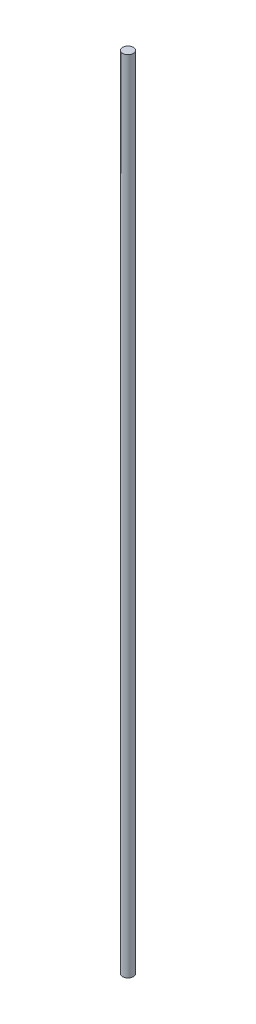
ISO-10303-21;
HEADER;
FILE_DESCRIPTION(('STEP AP214'),'2;1');
FILE_NAME('part.step','',(''),(''),'','','');
FILE_SCHEMA(('AUTOMOTIVE_DESIGN { 1 0 10303 214 1 1 1 1 }'));
ENDSEC;
DATA;
#1=APPLICATION_CONTEXT('core data for automotive mechanical design processes');
#2=APPLICATION_PROTOCOL_DEFINITION('international standard','automotive_design',2000,#1);
#3=PRODUCT_CONTEXT('',#1,'mechanical');
#4=PRODUCT('Part','Part','',(#3));
#5=PRODUCT_RELATED_PRODUCT_CATEGORY('part','',(#4));
#6=PRODUCT_DEFINITION_FORMATION('','',#4);
#7=PRODUCT_DEFINITION_CONTEXT('part definition',#1,'design');
#8=PRODUCT_DEFINITION('design','',#6,#7);
#9=PRODUCT_DEFINITION_SHAPE('','',#8);
#10=(LENGTH_UNIT() NAMED_UNIT(*) SI_UNIT(.MILLI.,.METRE.));
#11=(NAMED_UNIT(*) PLANE_ANGLE_UNIT() SI_UNIT($,.RADIAN.));
#12=(NAMED_UNIT(*) SI_UNIT($,.STERADIAN.) SOLID_ANGLE_UNIT());
#13=UNCERTAINTY_MEASURE_WITH_UNIT(LENGTH_MEASURE(1.E-05),#10,'distance_accuracy_value','');
#14=(GEOMETRIC_REPRESENTATION_CONTEXT(3) GLOBAL_UNCERTAINTY_ASSIGNED_CONTEXT((#13)) GLOBAL_UNIT_ASSIGNED_CONTEXT((#10,
#11,#12)) REPRESENTATION_CONTEXT('',''));
#15=CARTESIAN_POINT('',(0.,0.,0.));
#16=DIRECTION('',(0.,0.,1.));
#17=DIRECTION('',(1.,0.,0.));
#18=AXIS2_PLACEMENT_3D('',#15,#16,#17);
#19=CARTESIAN_POINT('',(0.,300.,0.));
#20=DIRECTION('',(0.,-1.,0.));
#21=DIRECTION('',(0.,0.,-1.));
#22=AXIS2_PLACEMENT_3D('',#19,#20,#21);
#23=CYLINDRICAL_SURFACE('',#22,4.);
#24=CARTESIAN_POINT('',(0.,300.,0.));
#25=DIRECTION('',(0.,1.,0.));
#26=DIRECTION('',(0.,0.,1.));
#27=AXIS2_PLACEMENT_3D('',#24,#25,#26);
#28=CIRCLE('',#27,4.);
#29=CARTESIAN_POINT('',(0.,300.,4.));
#30=VERTEX_POINT('',#29);
#31=EDGE_CURVE('E10',#30,#30,#28,.T.);
#32=ORIENTED_EDGE('',*,*,#31,.F.);
#33=EDGE_LOOP('',(#32));
#34=FACE_BOUND('',#33,.T.);
#35=CARTESIAN_POINT('',(0.,-300.,0.));
#36=DIRECTION('',(0.,1.,0.));
#37=DIRECTION('',(0.,0.,1.));
#38=AXIS2_PLACEMENT_3D('',#35,#36,#37);
#39=CIRCLE('',#38,4.);
#40=CARTESIAN_POINT('',(0.,-300.,4.));
#41=VERTEX_POINT('',#40);
#42=EDGE_CURVE('E38',#41,#41,#39,.T.);
#43=ORIENTED_EDGE('',*,*,#42,.T.);
#44=EDGE_LOOP('',(#43));
#45=FACE_BOUND('',#44,.T.);
#46=ADVANCED_FACE('F35',(#34,#45),#23,.T.);
#47=CARTESIAN_POINT('',(0.,300.,0.));
#48=DIRECTION('',(0.,1.,0.));
#49=DIRECTION('',(0.,0.,1.));
#50=AXIS2_PLACEMENT_3D('',#47,#48,#49);
#51=PLANE('',#50);
#52=ORIENTED_EDGE('',*,*,#31,.T.);
#53=EDGE_LOOP('',(#52));
#54=FACE_BOUND('',#53,.T.);
#55=ADVANCED_FACE('F50',(#54),#51,.T.);
#56=CARTESIAN_POINT('',(0.,-300.,0.));
#57=DIRECTION('',(0.,1.,0.));
#58=DIRECTION('',(0.,0.,1.));
#59=AXIS2_PLACEMENT_3D('',#56,#57,#58);
#60=PLANE('',#59);
#61=ORIENTED_EDGE('',*,*,#42,.F.);
#62=EDGE_LOOP('',(#61));
#63=FACE_BOUND('',#62,.T.);
#64=ADVANCED_FACE('F48',(#63),#60,.F.);
#65=CLOSED_SHELL('',(#46,#55,#64));
#66=MANIFOLD_SOLID_BREP('B2',#65);
#67=ADVANCED_BREP_SHAPE_REPRESENTATION('',(#18,#66),#14);
#68=SHAPE_DEFINITION_REPRESENTATION(#9,#67);
ENDSEC;
END-ISO-10303-21;
